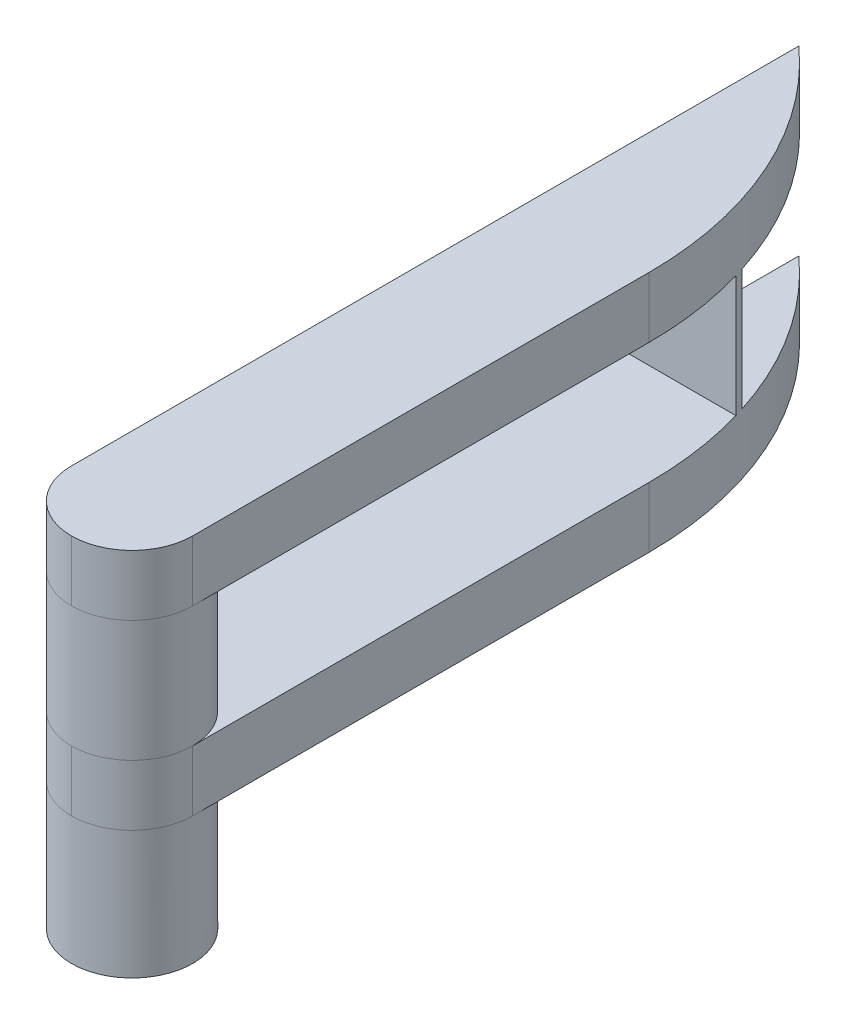
ISO-10303-21;
HEADER;
FILE_DESCRIPTION(('STEP AP214'),'2;1');
FILE_NAME('part.step','',(''),(''),'','','');
FILE_SCHEMA(('AUTOMOTIVE_DESIGN { 1 0 10303 214 1 1 1 1 }'));
ENDSEC;
DATA;
#1=APPLICATION_CONTEXT('core data for automotive mechanical design processes');
#2=APPLICATION_PROTOCOL_DEFINITION('international standard','automotive_design',2000,#1);
#3=PRODUCT_CONTEXT('',#1,'mechanical');
#4=PRODUCT('Part','Part','',(#3));
#5=PRODUCT_RELATED_PRODUCT_CATEGORY('part','',(#4));
#6=PRODUCT_DEFINITION_FORMATION('','',#4);
#7=PRODUCT_DEFINITION_CONTEXT('part definition',#1,'design');
#8=PRODUCT_DEFINITION('design','',#6,#7);
#9=PRODUCT_DEFINITION_SHAPE('','',#8);
#10=(LENGTH_UNIT() NAMED_UNIT(*) SI_UNIT(.MILLI.,.METRE.));
#11=(NAMED_UNIT(*) PLANE_ANGLE_UNIT() SI_UNIT($,.RADIAN.));
#12=(NAMED_UNIT(*) SI_UNIT($,.STERADIAN.) SOLID_ANGLE_UNIT());
#13=UNCERTAINTY_MEASURE_WITH_UNIT(LENGTH_MEASURE(1.E-05),#10,'distance_accuracy_value','');
#14=(GEOMETRIC_REPRESENTATION_CONTEXT(3) GLOBAL_UNCERTAINTY_ASSIGNED_CONTEXT((#13)) GLOBAL_UNIT_ASSIGNED_CONTEXT((#10,
#11,#12)) REPRESENTATION_CONTEXT('',''));
#15=CARTESIAN_POINT('',(0.,0.,0.));
#16=DIRECTION('',(0.,0.,1.));
#17=DIRECTION('',(1.,0.,0.));
#18=AXIS2_PLACEMENT_3D('',#15,#16,#17);
#19=CARTESIAN_POINT('',(10.,5.,0.));
#20=DIRECTION('',(0.,-1.,0.));
#21=DIRECTION('',(0.,0.,-1.));
#22=AXIS2_PLACEMENT_3D('',#19,#20,#21);
#23=PLANE('',#22);
#24=DIRECTION('',(0.,0.,1.));
#25=VECTOR('',#24,1.);
#26=CARTESIAN_POINT('',(0.,5.,0.));
#27=LINE('',#26,#25);
#28=CARTESIAN_POINT('',(0.,5.,-20.));
#29=VERTEX_POINT('',#28);
#30=CARTESIAN_POINT('',(0.,5.,-11.));
#31=VERTEX_POINT('',#30);
#32=EDGE_CURVE('E242',#29,#31,#27,.T.);
#33=ORIENTED_EDGE('',*,*,#32,.T.);
#34=DIRECTION('',(0.894427190999916,0.,0.447213595499958));
#35=VECTOR('',#34,1.);
#36=CARTESIAN_POINT('',(12.4,5.,-4.8));
#37=LINE('',#36,#35);
#38=CARTESIAN_POINT('',(8.59883837845029,5.,-6.70058081077485));
#39=VERTEX_POINT('',#38);
#40=EDGE_CURVE('E217',#31,#39,#37,.T.);
#41=ORIENTED_EDGE('',*,*,#40,.T.);
#42=CARTESIAN_POINT('',(-20.,5.,2.3606797749979));
#43=DIRECTION('',(0.,-1.,0.));
#44=DIRECTION('',(0.,0.,-1.));
#45=AXIS2_PLACEMENT_3D('',#42,#43,#44);
#46=CIRCLE('',#45,30.);
#47=EDGE_CURVE('E260',#39,#29,#46,.F.);
#48=ORIENTED_EDGE('',*,*,#47,.T.);
#49=EDGE_LOOP('',(#33,#41,#48));
#50=FACE_BOUND('',#49,.T.);
#51=ADVANCED_FACE('F45',(#50),#23,.F.);
#52=CARTESIAN_POINT('',(10.,0.,0.));
#53=DIRECTION('',(0.,-1.,0.));
#54=DIRECTION('',(0.,0.,-1.));
#55=AXIS2_PLACEMENT_3D('',#52,#53,#54);
#56=PLANE('',#55);
#57=CARTESIAN_POINT('',(5.,0.,40.));
#58=DIRECTION('',(0.,-1.,0.));
#59=DIRECTION('',(0.,0.,-1.));
#60=AXIS2_PLACEMENT_3D('',#57,#58,#59);
#61=CIRCLE('',#60,5.);
#62=CARTESIAN_POINT('',(0.,0.,40.));
#63=VERTEX_POINT('',#62);
#64=CARTESIAN_POINT('',(10.,0.,40.));
#65=VERTEX_POINT('',#64);
#66=EDGE_CURVE('E231',#63,#65,#61,.T.);
#67=ORIENTED_EDGE('',*,*,#66,.F.);
#68=DIRECTION('',(0.,0.,1.));
#69=VECTOR('',#68,1.);
#70=CARTESIAN_POINT('',(0.,0.,0.));
#71=LINE('',#70,#69);
#72=CARTESIAN_POINT('',(0.,0.,-20.));
#73=VERTEX_POINT('',#72);
#74=EDGE_CURVE('E247',#73,#63,#71,.T.);
#75=ORIENTED_EDGE('',*,*,#74,.F.);
#76=CARTESIAN_POINT('',(-20.,0.,2.3606797749979));
#77=DIRECTION('',(0.,-1.,0.));
#78=DIRECTION('',(0.,0.,-1.));
#79=AXIS2_PLACEMENT_3D('',#76,#77,#78);
#80=CIRCLE('',#79,30.);
#81=CARTESIAN_POINT('',(10.,0.,2.3606797749979));
#82=VERTEX_POINT('',#81);
#83=EDGE_CURVE('E264',#73,#82,#80,.T.);
#84=ORIENTED_EDGE('',*,*,#83,.T.);
#85=DIRECTION('',(0.,0.,1.));
#86=VECTOR('',#85,1.);
#87=CARTESIAN_POINT('',(10.,0.,0.));
#88=LINE('',#87,#86);
#89=EDGE_CURVE('E237',#82,#65,#88,.T.);
#90=ORIENTED_EDGE('',*,*,#89,.T.);
#91=EDGE_LOOP('',(#67,#75,#84,#90));
#92=FACE_BOUND('',#91,.T.);
#93=ADVANCED_FACE('F335',(#92),#56,.T.);
#94=CARTESIAN_POINT('',(10.,5.,2.3606797749979));
#95=VERTEX_POINT('',#94);
#96=CARTESIAN_POINT('',(8.81143928546335,5.,-5.99999999999999));
#97=VERTEX_POINT('',#96);
#98=EDGE_CURVE('E261',#95,#97,#46,.F.);
#99=ORIENTED_EDGE('',*,*,#98,.T.);
#100=DIRECTION('',(-1.,0.,0.));
#101=VECTOR('',#100,1.);
#102=CARTESIAN_POINT('',(10.,5.,-6.));
#103=LINE('',#102,#101);
#104=CARTESIAN_POINT('',(0.,5.,-6.));
#105=VERTEX_POINT('',#104);
#106=EDGE_CURVE('E214',#97,#105,#103,.T.);
#107=ORIENTED_EDGE('',*,*,#106,.T.);
#108=CARTESIAN_POINT('',(0.,5.,40.));
#109=VERTEX_POINT('',#108);
#110=EDGE_CURVE('E156',#105,#109,#27,.T.);
#111=ORIENTED_EDGE('',*,*,#110,.T.);
#112=CARTESIAN_POINT('',(5.,4.99999999999999,40.));
#113=DIRECTION('',(0.,-1.,0.));
#114=DIRECTION('',(0.,0.,-1.));
#115=AXIS2_PLACEMENT_3D('',#112,#113,#114);
#116=CIRCLE('',#115,5.);
#117=CARTESIAN_POINT('',(10.,4.99999999999999,40.));
#118=VERTEX_POINT('',#117);
#119=EDGE_CURVE('E225',#109,#118,#116,.T.);
#120=ORIENTED_EDGE('',*,*,#119,.T.);
#121=DIRECTION('',(0.,0.,1.));
#122=VECTOR('',#121,1.);
#123=CARTESIAN_POINT('',(10.,5.,0.));
#124=LINE('',#123,#122);
#125=EDGE_CURVE('E241',#95,#118,#124,.T.);
#126=ORIENTED_EDGE('',*,*,#125,.F.);
#127=EDGE_LOOP('',(#99,#107,#111,#120,#126));
#128=FACE_BOUND('',#127,.T.);
#129=ADVANCED_FACE('F343',(#128),#23,.F.);
#130=CARTESIAN_POINT('',(10.,0.,0.));
#131=DIRECTION('',(1.,0.,0.));
#132=DIRECTION('',(0.,0.,-1.));
#133=AXIS2_PLACEMENT_3D('',#130,#131,#132);
#134=PLANE('',#133);
#135=ORIENTED_EDGE('',*,*,#125,.T.);
#136=DIRECTION('',(0.,1.,0.));
#137=VECTOR('',#136,1.);
#138=CARTESIAN_POINT('',(10.,0.,40.));
#139=LINE('',#138,#137);
#140=EDGE_CURVE('E271',#118,#65,#139,.F.);
#141=ORIENTED_EDGE('',*,*,#140,.T.);
#142=ORIENTED_EDGE('',*,*,#89,.F.);
#143=DIRECTION('',(0.,-1.,0.));
#144=VECTOR('',#143,1.);
#145=CARTESIAN_POINT('',(10.,4.99999999999999,2.3606797749979));
#146=LINE('',#145,#144);
#147=EDGE_CURVE('E246',#82,#95,#146,.F.);
#148=ORIENTED_EDGE('',*,*,#147,.T.);
#149=EDGE_LOOP('',(#135,#141,#142,#148));
#150=FACE_BOUND('',#149,.T.);
#151=ADVANCED_FACE('F340',(#150),#134,.T.);
#152=CARTESIAN_POINT('',(0.,0.,0.));
#153=DIRECTION('',(1.,0.,0.));
#154=DIRECTION('',(0.,0.,-1.));
#155=AXIS2_PLACEMENT_3D('',#152,#153,#154);
#156=PLANE('',#155);
#157=DIRECTION('',(0.,0.,1.));
#158=VECTOR('',#157,1.);
#159=CARTESIAN_POINT('',(0.,15.,0.));
#160=LINE('',#159,#158);
#161=CARTESIAN_POINT('',(0.,15.,-6.));
#162=VERTEX_POINT('',#161);
#163=CARTESIAN_POINT('',(0.,15.,40.));
#164=VERTEX_POINT('',#163);
#165=EDGE_CURVE('E153',#162,#164,#160,.T.);
#166=ORIENTED_EDGE('',*,*,#165,.T.);
#167=DIRECTION('',(0.,1.,0.));
#168=VECTOR('',#167,1.);
#169=CARTESIAN_POINT('',(0.,20.,40.));
#170=LINE('',#169,#168);
#171=CARTESIAN_POINT('',(0.,20.,40.));
#172=VERTEX_POINT('',#171);
#173=EDGE_CURVE('E11',#164,#172,#170,.T.);
#174=ORIENTED_EDGE('',*,*,#173,.T.);
#175=DIRECTION('',(0.,0.,1.));
#176=VECTOR('',#175,1.);
#177=CARTESIAN_POINT('',(0.,20.,0.));
#178=LINE('',#177,#176);
#179=CARTESIAN_POINT('',(0.,20.,-20.));
#180=VERTEX_POINT('',#179);
#181=EDGE_CURVE('E190',#180,#172,#178,.T.);
#182=ORIENTED_EDGE('',*,*,#181,.F.);
#183=DIRECTION('',(0.,1.,0.));
#184=VECTOR('',#183,1.);
#185=CARTESIAN_POINT('',(0.,0.,-20.));
#186=LINE('',#185,#184);
#187=CARTESIAN_POINT('',(0.,15.,-20.));
#188=VERTEX_POINT('',#187);
#189=EDGE_CURVE('E182',#188,#180,#186,.T.);
#190=ORIENTED_EDGE('',*,*,#189,.F.);
#191=CARTESIAN_POINT('',(0.,15.,-11.));
#192=VERTEX_POINT('',#191);
#193=EDGE_CURVE('E178',#188,#192,#160,.T.);
#194=ORIENTED_EDGE('',*,*,#193,.T.);
#195=DIRECTION('',(0.,1.,0.));
#196=VECTOR('',#195,1.);
#197=CARTESIAN_POINT('',(0.,4.00000000000001,-11.));
#198=LINE('',#197,#196);
#199=EDGE_CURVE('E160',#31,#192,#198,.T.);
#200=ORIENTED_EDGE('',*,*,#199,.F.);
#201=ORIENTED_EDGE('',*,*,#32,.F.);
#202=DIRECTION('',(0.,1.,0.));
#203=VECTOR('',#202,1.);
#204=CARTESIAN_POINT('',(0.,0.,-20.));
#205=LINE('',#204,#203);
#206=EDGE_CURVE('E251',#73,#29,#205,.T.);
#207=ORIENTED_EDGE('',*,*,#206,.F.);
#208=ORIENTED_EDGE('',*,*,#74,.T.);
#209=DIRECTION('',(0.,1.,0.));
#210=VECTOR('',#209,1.);
#211=CARTESIAN_POINT('',(0.,4.99999999999999,40.));
#212=LINE('',#211,#210);
#213=EDGE_CURVE('E55',#63,#109,#212,.T.);
#214=ORIENTED_EDGE('',*,*,#213,.T.);
#215=ORIENTED_EDGE('',*,*,#110,.F.);
#216=DIRECTION('',(0.,1.,0.));
#217=VECTOR('',#216,1.);
#218=CARTESIAN_POINT('',(0.,4.00000000000001,-6.));
#219=LINE('',#218,#217);
#220=EDGE_CURVE('E149',#105,#162,#219,.T.);
#221=ORIENTED_EDGE('',*,*,#220,.T.);
#222=EDGE_LOOP('',(#166,#174,#182,#190,#194,#200,#201,#207,#208,#214,#215,#221));
#223=FACE_BOUND('',#222,.T.);
#224=ADVANCED_FACE('F151',(#223),#156,.F.);
#225=CARTESIAN_POINT('',(-20.,0.,2.3606797749979));
#226=DIRECTION('',(0.,1.,0.));
#227=DIRECTION('',(0.,0.,1.));
#228=AXIS2_PLACEMENT_3D('',#225,#226,#227);
#229=CYLINDRICAL_SURFACE('',#228,30.);
#230=ORIENTED_EDGE('',*,*,#47,.F.);
#231=DIRECTION('',(0.,1.,0.));
#232=VECTOR('',#231,1.);
#233=CARTESIAN_POINT('',(8.59883837845029,15.,-6.70058081077485));
#234=LINE('',#233,#232);
#235=CARTESIAN_POINT('',(8.59883837845029,15.,-6.70058081077485));
#236=VERTEX_POINT('',#235);
#237=EDGE_CURVE('E205',#236,#39,#234,.F.);
#238=ORIENTED_EDGE('',*,*,#237,.F.);
#239=CARTESIAN_POINT('',(-20.,15.,2.3606797749979));
#240=DIRECTION('',(0.,-1.,0.));
#241=DIRECTION('',(0.,0.,-1.));
#242=AXIS2_PLACEMENT_3D('',#239,#240,#241);
#243=CIRCLE('',#242,30.);
#244=EDGE_CURVE('E202',#188,#236,#243,.T.);
#245=ORIENTED_EDGE('',*,*,#244,.F.);
#246=ORIENTED_EDGE('',*,*,#189,.T.);
#247=CARTESIAN_POINT('',(-20.,20.,2.3606797749979));
#248=DIRECTION('',(0.,-1.,0.));
#249=DIRECTION('',(0.,0.,-1.));
#250=AXIS2_PLACEMENT_3D('',#247,#248,#249);
#251=CIRCLE('',#250,30.);
#252=CARTESIAN_POINT('',(10.,20.,2.3606797749979));
#253=VERTEX_POINT('',#252);
#254=EDGE_CURVE('E198',#253,#180,#251,.F.);
#255=ORIENTED_EDGE('',*,*,#254,.F.);
#256=DIRECTION('',(0.,-1.,0.));
#257=VECTOR('',#256,1.);
#258=CARTESIAN_POINT('',(10.,20.,2.3606797749979));
#259=LINE('',#258,#257);
#260=CARTESIAN_POINT('',(10.,15.,2.3606797749979));
#261=VERTEX_POINT('',#260);
#262=EDGE_CURVE('E194',#261,#253,#259,.F.);
#263=ORIENTED_EDGE('',*,*,#262,.F.);
#264=CARTESIAN_POINT('',(-20.,15.,2.3606797749979));
#265=DIRECTION('',(0.,-1.,0.));
#266=DIRECTION('',(0.,0.,-1.));
#267=AXIS2_PLACEMENT_3D('',#264,#265,#266);
#268=CIRCLE('',#267,30.);
#269=CARTESIAN_POINT('',(8.81143928546335,15.,-6.));
#270=VERTEX_POINT('',#269);
#271=EDGE_CURVE('E211',#270,#261,#268,.T.);
#272=ORIENTED_EDGE('',*,*,#271,.F.);
#273=DIRECTION('',(0.,1.,0.));
#274=VECTOR('',#273,1.);
#275=CARTESIAN_POINT('',(8.81143928546335,4.00000000000001,-6.));
#276=LINE('',#275,#274);
#277=EDGE_CURVE('E166',#97,#270,#276,.T.);
#278=ORIENTED_EDGE('',*,*,#277,.F.);
#279=ORIENTED_EDGE('',*,*,#98,.F.);
#280=ORIENTED_EDGE('',*,*,#147,.F.);
#281=ORIENTED_EDGE('',*,*,#83,.F.);
#282=ORIENTED_EDGE('',*,*,#206,.T.);
#283=EDGE_LOOP('',(#230,#238,#245,#246,#255,#263,#272,#278,#279,#280,#281,#282));
#284=FACE_BOUND('',#283,.T.);
#285=ADVANCED_FACE('F329',(#284),#229,.T.);
#286=CARTESIAN_POINT('',(5.,-10.55,40.));
#287=DIRECTION('',(0.,1.,0.));
#288=DIRECTION('',(0.,0.,1.));
#289=AXIS2_PLACEMENT_3D('',#286,#287,#288);
#290=CYLINDRICAL_SURFACE('',#289,5.);
#291=CARTESIAN_POINT('',(5.,15.,40.));
#292=DIRECTION('',(0.,-1.,0.));
#293=DIRECTION('',(0.,0.,-1.));
#294=AXIS2_PLACEMENT_3D('',#291,#292,#293);
#295=CIRCLE('',#294,5.);
#296=CARTESIAN_POINT('',(5.,15.,45.));
#297=VERTEX_POINT('',#296);
#298=EDGE_CURVE('E270',#164,#297,#295,.F.);
#299=ORIENTED_EDGE('',*,*,#298,.F.);
#300=CARTESIAN_POINT('',(10.,15.,40.));
#301=VERTEX_POINT('',#300);
#302=EDGE_CURVE('E176',#301,#164,#295,.F.);
#303=ORIENTED_EDGE('',*,*,#302,.F.);
#304=EDGE_CURVE('E269',#297,#301,#295,.F.);
#305=ORIENTED_EDGE('',*,*,#304,.F.);
#306=EDGE_LOOP('',(#299,#303,#305));
#307=FACE_BOUND('',#306,.T.);
#308=CARTESIAN_POINT('',(5.,4.99999999999999,45.));
#309=VERTEX_POINT('',#308);
#310=EDGE_CURVE('E230',#309,#109,#116,.T.);
#311=ORIENTED_EDGE('',*,*,#310,.F.);
#312=EDGE_CURVE('E229',#118,#309,#116,.T.);
#313=ORIENTED_EDGE('',*,*,#312,.F.);
#314=ORIENTED_EDGE('',*,*,#119,.F.);
#315=EDGE_LOOP('',(#311,#313,#314));
#316=FACE_BOUND('',#315,.T.);
#317=ADVANCED_FACE('F346',(#307,#316),#290,.T.);
#318=CARTESIAN_POINT('',(5.,0.,45.));
#319=VERTEX_POINT('',#318);
#320=EDGE_CURVE('E235',#65,#319,#61,.T.);
#321=ORIENTED_EDGE('',*,*,#320,.T.);
#322=EDGE_CURVE('E236',#319,#63,#61,.T.);
#323=ORIENTED_EDGE('',*,*,#322,.T.);
#324=ORIENTED_EDGE('',*,*,#66,.T.);
#325=EDGE_LOOP('',(#321,#323,#324));
#326=FACE_BOUND('',#325,.T.);
#327=CARTESIAN_POINT('',(5.,-10.55,40.));
#328=DIRECTION('',(0.,1.,0.));
#329=DIRECTION('',(0.,0.,1.));
#330=AXIS2_PLACEMENT_3D('',#327,#328,#329);
#331=CIRCLE('',#330,5.);
#332=CARTESIAN_POINT('',(5.,-10.55,45.));
#333=VERTEX_POINT('',#332);
#334=EDGE_CURVE('E221',#333,#333,#331,.T.);
#335=ORIENTED_EDGE('',*,*,#334,.T.);
#336=EDGE_LOOP('',(#335));
#337=FACE_BOUND('',#336,.T.);
#338=ADVANCED_FACE('F353',(#326,#337),#290,.T.);
#339=CARTESIAN_POINT('',(5.,-10.55,40.));
#340=DIRECTION('',(0.,1.,0.));
#341=DIRECTION('',(0.,0.,1.));
#342=AXIS2_PLACEMENT_3D('',#339,#340,#341);
#343=PLANE('',#342);
#344=ORIENTED_EDGE('',*,*,#334,.F.);
#345=EDGE_LOOP('',(#344));
#346=FACE_BOUND('',#345,.T.);
#347=ADVANCED_FACE('F356',(#346),#343,.F.);
#348=CARTESIAN_POINT('',(4.4,4.00000000000001,-8.8));
#349=DIRECTION('',(0.447213595499958,0.,-0.894427190999916));
#350=DIRECTION('',(-0.894427190999916,0.,-0.447213595499958));
#351=AXIS2_PLACEMENT_3D('',#348,#349,#350);
#352=PLANE('',#351);
#353=ORIENTED_EDGE('',*,*,#40,.F.);
#354=ORIENTED_EDGE('',*,*,#199,.T.);
#355=DIRECTION('',(-0.894427190999916,0.,-0.447213595499958));
#356=VECTOR('',#355,1.);
#357=CARTESIAN_POINT('',(4.4,15.,-8.8));
#358=LINE('',#357,#356);
#359=EDGE_CURVE('E170',#236,#192,#358,.T.);
#360=ORIENTED_EDGE('',*,*,#359,.F.);
#361=ORIENTED_EDGE('',*,*,#237,.T.);
#362=EDGE_LOOP('',(#353,#354,#360,#361));
#363=FACE_BOUND('',#362,.T.);
#364=ADVANCED_FACE('F320',(#363),#352,.T.);
#365=CARTESIAN_POINT('',(0.,4.00000000000001,-6.));
#366=DIRECTION('',(0.,0.,1.));
#367=DIRECTION('',(0.,-1.,0.));
#368=AXIS2_PLACEMENT_3D('',#365,#366,#367);
#369=PLANE('',#368);
#370=ORIENTED_EDGE('',*,*,#106,.F.);
#371=ORIENTED_EDGE('',*,*,#277,.T.);
#372=DIRECTION('',(1.,0.,0.));
#373=VECTOR('',#372,1.);
#374=CARTESIAN_POINT('',(0.,15.,-6.));
#375=LINE('',#374,#373);
#376=EDGE_CURVE('E163',#162,#270,#375,.T.);
#377=ORIENTED_EDGE('',*,*,#376,.F.);
#378=ORIENTED_EDGE('',*,*,#220,.F.);
#379=EDGE_LOOP('',(#370,#371,#377,#378));
#380=FACE_BOUND('',#379,.T.);
#381=ADVANCED_FACE('F164',(#380),#369,.T.);
#382=CARTESIAN_POINT('',(10.,0.,0.));
#383=DIRECTION('',(1.,0.,0.));
#384=DIRECTION('',(0.,0.,-1.));
#385=AXIS2_PLACEMENT_3D('',#382,#383,#384);
#386=PLANE('',#385);
#387=DIRECTION('',(0.,0.,1.));
#388=VECTOR('',#387,1.);
#389=CARTESIAN_POINT('',(10.,20.,0.));
#390=LINE('',#389,#388);
#391=CARTESIAN_POINT('',(10.,20.,40.));
#392=VERTEX_POINT('',#391);
#393=EDGE_CURVE('E185',#253,#392,#390,.T.);
#394=ORIENTED_EDGE('',*,*,#393,.T.);
#395=DIRECTION('',(0.,1.,0.));
#396=VECTOR('',#395,1.);
#397=CARTESIAN_POINT('',(10.,0.,40.));
#398=LINE('',#397,#396);
#399=EDGE_CURVE('E279',#392,#301,#398,.F.);
#400=ORIENTED_EDGE('',*,*,#399,.T.);
#401=DIRECTION('',(0.,0.,1.));
#402=VECTOR('',#401,1.);
#403=CARTESIAN_POINT('',(10.,15.,0.));
#404=LINE('',#403,#402);
#405=EDGE_CURVE('E193',#261,#301,#404,.T.);
#406=ORIENTED_EDGE('',*,*,#405,.F.);
#407=ORIENTED_EDGE('',*,*,#262,.T.);
#408=EDGE_LOOP('',(#394,#400,#406,#407));
#409=FACE_BOUND('',#408,.T.);
#410=ADVANCED_FACE('F393',(#409),#386,.T.);
#411=CARTESIAN_POINT('',(10.,15.,0.));
#412=DIRECTION('',(0.,-1.,0.));
#413=DIRECTION('',(0.,0.,-1.));
#414=AXIS2_PLACEMENT_3D('',#411,#412,#413);
#415=PLANE('',#414);
#416=ORIENTED_EDGE('',*,*,#193,.F.);
#417=ORIENTED_EDGE('',*,*,#244,.T.);
#418=ORIENTED_EDGE('',*,*,#359,.T.);
#419=EDGE_LOOP('',(#416,#417,#418));
#420=FACE_BOUND('',#419,.T.);
#421=ADVANCED_FACE('F325',(#420),#415,.T.);
#422=ORIENTED_EDGE('',*,*,#405,.T.);
#423=ORIENTED_EDGE('',*,*,#302,.T.);
#424=ORIENTED_EDGE('',*,*,#165,.F.);
#425=ORIENTED_EDGE('',*,*,#376,.T.);
#426=ORIENTED_EDGE('',*,*,#271,.T.);
#427=EDGE_LOOP('',(#422,#423,#424,#425,#426));
#428=FACE_BOUND('',#427,.T.);
#429=ADVANCED_FACE('F174',(#428),#415,.T.);
#430=CARTESIAN_POINT('',(5.,20.,40.));
#431=DIRECTION('',(0.,1.,0.));
#432=DIRECTION('',(0.,0.,1.));
#433=AXIS2_PLACEMENT_3D('',#430,#431,#432);
#434=PLANE('',#433);
#435=CARTESIAN_POINT('',(5.,20.,40.));
#436=DIRECTION('',(0.,1.,0.));
#437=DIRECTION('',(0.,0.,1.));
#438=AXIS2_PLACEMENT_3D('',#435,#436,#437);
#439=CIRCLE('',#438,5.);
#440=CARTESIAN_POINT('',(5.,20.,45.));
#441=VERTEX_POINT('',#440);
#442=EDGE_CURVE('E68',#172,#441,#439,.T.);
#443=ORIENTED_EDGE('',*,*,#442,.T.);
#444=CARTESIAN_POINT('',(5.,20.,40.));
#445=DIRECTION('',(0.,1.,0.));
#446=DIRECTION('',(0.,0.,1.));
#447=AXIS2_PLACEMENT_3D('',#444,#445,#446);
#448=CIRCLE('',#447,5.);
#449=EDGE_CURVE('E63',#441,#392,#448,.T.);
#450=ORIENTED_EDGE('',*,*,#449,.T.);
#451=ORIENTED_EDGE('',*,*,#393,.F.);
#452=ORIENTED_EDGE('',*,*,#254,.T.);
#453=ORIENTED_EDGE('',*,*,#181,.T.);
#454=EDGE_LOOP('',(#443,#450,#451,#452,#453));
#455=FACE_BOUND('',#454,.T.);
#456=ADVANCED_FACE('F383',(#455),#434,.T.);
#457=CARTESIAN_POINT('',(5.,0.,40.));
#458=DIRECTION('',(0.,-1.,0.));
#459=DIRECTION('',(0.,0.,-1.));
#460=AXIS2_PLACEMENT_3D('',#457,#458,#459);
#461=CYLINDRICAL_SURFACE('',#460,5.);
#462=ORIENTED_EDGE('',*,*,#213,.F.);
#463=ORIENTED_EDGE('',*,*,#322,.F.);
#464=DIRECTION('',(0.,1.,0.));
#465=VECTOR('',#464,1.);
#466=CARTESIAN_POINT('',(5.,0.,45.));
#467=LINE('',#466,#465);
#468=EDGE_CURVE('E284',#309,#319,#467,.F.);
#469=ORIENTED_EDGE('',*,*,#468,.F.);
#470=ORIENTED_EDGE('',*,*,#310,.T.);
#471=EDGE_LOOP('',(#462,#463,#469,#470));
#472=FACE_BOUND('',#471,.T.);
#473=ADVANCED_FACE('F349',(#472),#461,.T.);
#474=CARTESIAN_POINT('',(5.,0.,40.));
#475=DIRECTION('',(0.,1.,0.));
#476=DIRECTION('',(0.,0.,1.));
#477=AXIS2_PLACEMENT_3D('',#474,#475,#476);
#478=CYLINDRICAL_SURFACE('',#477,5.);
#479=ORIENTED_EDGE('',*,*,#320,.F.);
#480=ORIENTED_EDGE('',*,*,#140,.F.);
#481=ORIENTED_EDGE('',*,*,#312,.T.);
#482=ORIENTED_EDGE('',*,*,#468,.T.);
#483=EDGE_LOOP('',(#479,#480,#481,#482));
#484=FACE_BOUND('',#483,.T.);
#485=ADVANCED_FACE('F351',(#484),#478,.T.);
#486=CARTESIAN_POINT('',(5.,0.,40.));
#487=DIRECTION('',(0.,-1.,0.));
#488=DIRECTION('',(0.,0.,-1.));
#489=AXIS2_PLACEMENT_3D('',#486,#487,#488);
#490=CYLINDRICAL_SURFACE('',#489,5.);
#491=ORIENTED_EDGE('',*,*,#173,.F.);
#492=ORIENTED_EDGE('',*,*,#298,.T.);
#493=DIRECTION('',(0.,1.,0.));
#494=VECTOR('',#493,1.);
#495=CARTESIAN_POINT('',(5.,15.,45.));
#496=LINE('',#495,#494);
#497=EDGE_CURVE('E49',#441,#297,#496,.F.);
#498=ORIENTED_EDGE('',*,*,#497,.F.);
#499=ORIENTED_EDGE('',*,*,#442,.F.);
#500=EDGE_LOOP('',(#491,#492,#498,#499));
#501=FACE_BOUND('',#500,.T.);
#502=ADVANCED_FACE('F47',(#501),#490,.T.);
#503=CARTESIAN_POINT('',(5.,0.,40.));
#504=DIRECTION('',(0.,1.,0.));
#505=DIRECTION('',(0.,0.,1.));
#506=AXIS2_PLACEMENT_3D('',#503,#504,#505);
#507=CYLINDRICAL_SURFACE('',#506,5.);
#508=ORIENTED_EDGE('',*,*,#304,.T.);
#509=ORIENTED_EDGE('',*,*,#399,.F.);
#510=ORIENTED_EDGE('',*,*,#449,.F.);
#511=ORIENTED_EDGE('',*,*,#497,.T.);
#512=EDGE_LOOP('',(#508,#509,#510,#511));
#513=FACE_BOUND('',#512,.T.);
#514=ADVANCED_FACE('F296',(#513),#507,.T.);
#515=CLOSED_SHELL('',(#51,#93,#129,#151,#224,#285,#317,#338,#347,#364,#381,#410,#421,#429,#456,
#473,#485,#502,#514));
#516=MANIFOLD_SOLID_BREP('B2',#515);
#517=ADVANCED_BREP_SHAPE_REPRESENTATION('',(#18,#516),#14);
#518=SHAPE_DEFINITION_REPRESENTATION(#9,#517);
ENDSEC;
END-ISO-10303-21;
